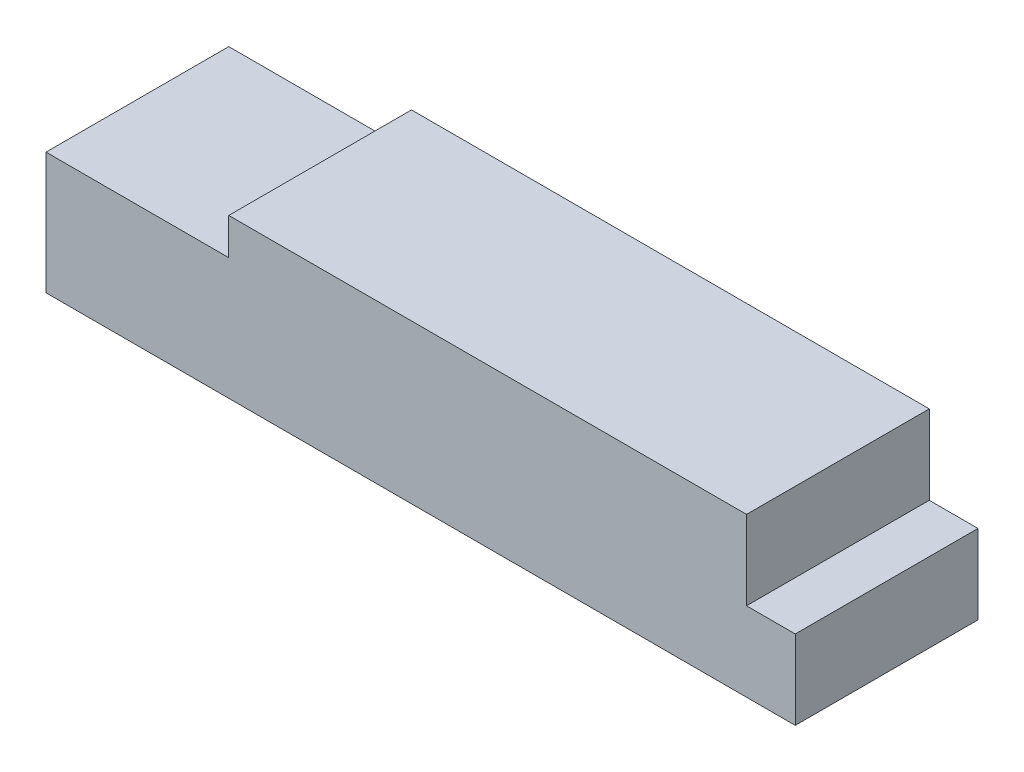
ISO-10303-21;
HEADER;
FILE_DESCRIPTION(('STEP AP214'),'2;1');
FILE_NAME('part.step','',(''),(''),'','','');
FILE_SCHEMA(('AUTOMOTIVE_DESIGN { 1 0 10303 214 1 1 1 1 }'));
ENDSEC;
DATA;
#1=APPLICATION_CONTEXT('core data for automotive mechanical design processes');
#2=APPLICATION_PROTOCOL_DEFINITION('international standard','automotive_design',2000,#1);
#3=PRODUCT_CONTEXT('',#1,'mechanical');
#4=PRODUCT('Part','Part','',(#3));
#5=PRODUCT_RELATED_PRODUCT_CATEGORY('part','',(#4));
#6=PRODUCT_DEFINITION_FORMATION('','',#4);
#7=PRODUCT_DEFINITION_CONTEXT('part definition',#1,'design');
#8=PRODUCT_DEFINITION('design','',#6,#7);
#9=PRODUCT_DEFINITION_SHAPE('','',#8);
#10=(LENGTH_UNIT() NAMED_UNIT(*) SI_UNIT(.MILLI.,.METRE.));
#11=(NAMED_UNIT(*) PLANE_ANGLE_UNIT() SI_UNIT($,.RADIAN.));
#12=(NAMED_UNIT(*) SI_UNIT($,.STERADIAN.) SOLID_ANGLE_UNIT());
#13=UNCERTAINTY_MEASURE_WITH_UNIT(LENGTH_MEASURE(1.E-05),#10,'distance_accuracy_value','');
#14=(GEOMETRIC_REPRESENTATION_CONTEXT(3) GLOBAL_UNCERTAINTY_ASSIGNED_CONTEXT((#13)) GLOBAL_UNIT_ASSIGNED_CONTEXT((#10,
#11,#12)) REPRESENTATION_CONTEXT('',''));
#15=CARTESIAN_POINT('',(0.,0.,0.));
#16=DIRECTION('',(0.,0.,1.));
#17=DIRECTION('',(1.,0.,0.));
#18=AXIS2_PLACEMENT_3D('',#15,#16,#17);
#19=CARTESIAN_POINT('',(0.,20.,15.));
#20=DIRECTION('',(1.,0.,0.));
#21=DIRECTION('',(0.,0.,-1.));
#22=AXIS2_PLACEMENT_3D('',#19,#20,#21);
#23=PLANE('',#22);
#24=DIRECTION('',(0.,-1.,0.));
#25=VECTOR('',#24,1.);
#26=CARTESIAN_POINT('',(0.,20.,-15.));
#27=LINE('',#26,#25);
#28=CARTESIAN_POINT('',(0.,20.,-15.));
#29=VERTEX_POINT('',#28);
#30=CARTESIAN_POINT('',(0.,0.,-15.));
#31=VERTEX_POINT('',#30);
#32=EDGE_CURVE('E137',#29,#31,#27,.T.);
#33=ORIENTED_EDGE('',*,*,#32,.T.);
#34=DIRECTION('',(0.,0.,-1.));
#35=VECTOR('',#34,1.);
#36=CARTESIAN_POINT('',(0.,0.,15.));
#37=LINE('',#36,#35);
#38=CARTESIAN_POINT('',(0.,0.,15.));
#39=VERTEX_POINT('',#38);
#40=EDGE_CURVE('E11',#39,#31,#37,.T.);
#41=ORIENTED_EDGE('',*,*,#40,.F.);
#42=DIRECTION('',(0.,-1.,0.));
#43=VECTOR('',#42,1.);
#44=CARTESIAN_POINT('',(0.,20.,15.));
#45=LINE('',#44,#43);
#46=CARTESIAN_POINT('',(0.,20.,15.));
#47=VERTEX_POINT('',#46);
#48=EDGE_CURVE('E151',#47,#39,#45,.T.);
#49=ORIENTED_EDGE('',*,*,#48,.F.);
#50=DIRECTION('',(0.,0.,-1.));
#51=VECTOR('',#50,1.);
#52=CARTESIAN_POINT('',(0.,20.,15.));
#53=LINE('',#52,#51);
#54=EDGE_CURVE('E133',#47,#29,#53,.T.);
#55=ORIENTED_EDGE('',*,*,#54,.T.);
#56=EDGE_LOOP('',(#33,#41,#49,#55));
#57=FACE_BOUND('',#56,.T.);
#58=ADVANCED_FACE('F41',(#57),#23,.F.);
#59=CARTESIAN_POINT('',(0.,0.,15.));
#60=DIRECTION('',(0.,1.,0.));
#61=DIRECTION('',(0.,0.,1.));
#62=AXIS2_PLACEMENT_3D('',#59,#60,#61);
#63=PLANE('',#62);
#64=DIRECTION('',(1.,0.,0.));
#65=VECTOR('',#64,1.);
#66=CARTESIAN_POINT('',(0.,0.,-15.));
#67=LINE('',#66,#65);
#68=CARTESIAN_POINT('',(123.,0.,-15.));
#69=VERTEX_POINT('',#68);
#70=EDGE_CURVE('E140',#31,#69,#67,.T.);
#71=ORIENTED_EDGE('',*,*,#70,.T.);
#72=DIRECTION('',(0.,0.,-1.));
#73=VECTOR('',#72,1.);
#74=CARTESIAN_POINT('',(123.,0.,15.));
#75=LINE('',#74,#73);
#76=CARTESIAN_POINT('',(123.,0.,15.));
#77=VERTEX_POINT('',#76);
#78=EDGE_CURVE('E49',#77,#69,#75,.T.);
#79=ORIENTED_EDGE('',*,*,#78,.F.);
#80=DIRECTION('',(1.,0.,0.));
#81=VECTOR('',#80,1.);
#82=CARTESIAN_POINT('',(0.,0.,15.));
#83=LINE('',#82,#81);
#84=EDGE_CURVE('E100',#39,#77,#83,.T.);
#85=ORIENTED_EDGE('',*,*,#84,.F.);
#86=ORIENTED_EDGE('',*,*,#40,.T.);
#87=EDGE_LOOP('',(#71,#79,#85,#86));
#88=FACE_BOUND('',#87,.T.);
#89=ADVANCED_FACE('F186',(#88),#63,.F.);
#90=CARTESIAN_POINT('',(123.,0.,15.));
#91=DIRECTION('',(-1.,0.,0.));
#92=DIRECTION('',(0.,-1.,0.));
#93=AXIS2_PLACEMENT_3D('',#90,#91,#92);
#94=PLANE('',#93);
#95=DIRECTION('',(0.,1.,0.));
#96=VECTOR('',#95,1.);
#97=CARTESIAN_POINT('',(123.,0.,-15.));
#98=LINE('',#97,#96);
#99=CARTESIAN_POINT('',(123.,13.,-15.));
#100=VERTEX_POINT('',#99);
#101=EDGE_CURVE('E142',#69,#100,#98,.T.);
#102=ORIENTED_EDGE('',*,*,#101,.T.);
#103=DIRECTION('',(0.,0.,-1.));
#104=VECTOR('',#103,1.);
#105=CARTESIAN_POINT('',(123.,13.,15.));
#106=LINE('',#105,#104);
#107=CARTESIAN_POINT('',(123.,13.,15.));
#108=VERTEX_POINT('',#107);
#109=EDGE_CURVE('E158',#108,#100,#106,.T.);
#110=ORIENTED_EDGE('',*,*,#109,.F.);
#111=DIRECTION('',(0.,1.,0.));
#112=VECTOR('',#111,1.);
#113=CARTESIAN_POINT('',(123.,0.,15.));
#114=LINE('',#113,#112);
#115=EDGE_CURVE('E166',#77,#108,#114,.T.);
#116=ORIENTED_EDGE('',*,*,#115,.F.);
#117=ORIENTED_EDGE('',*,*,#78,.T.);
#118=EDGE_LOOP('',(#102,#110,#116,#117));
#119=FACE_BOUND('',#118,.T.);
#120=ADVANCED_FACE('F164',(#119),#94,.F.);
#121=CARTESIAN_POINT('',(123.,13.,15.));
#122=DIRECTION('',(0.,-1.,0.));
#123=DIRECTION('',(1.,0.,0.));
#124=AXIS2_PLACEMENT_3D('',#121,#122,#123);
#125=PLANE('',#124);
#126=DIRECTION('',(-1.,0.,0.));
#127=VECTOR('',#126,1.);
#128=CARTESIAN_POINT('',(123.,13.,-15.));
#129=LINE('',#128,#127);
#130=CARTESIAN_POINT('',(115.,13.,-15.));
#131=VERTEX_POINT('',#130);
#132=EDGE_CURVE('E144',#100,#131,#129,.T.);
#133=ORIENTED_EDGE('',*,*,#132,.T.);
#134=DIRECTION('',(0.,0.,-1.));
#135=VECTOR('',#134,1.);
#136=CARTESIAN_POINT('',(115.,13.,15.));
#137=LINE('',#136,#135);
#138=CARTESIAN_POINT('',(115.,13.,15.));
#139=VERTEX_POINT('',#138);
#140=EDGE_CURVE('E155',#139,#131,#137,.T.);
#141=ORIENTED_EDGE('',*,*,#140,.F.);
#142=DIRECTION('',(-1.,0.,0.));
#143=VECTOR('',#142,1.);
#144=CARTESIAN_POINT('',(123.,13.,15.));
#145=LINE('',#144,#143);
#146=EDGE_CURVE('E178',#108,#139,#145,.T.);
#147=ORIENTED_EDGE('',*,*,#146,.F.);
#148=ORIENTED_EDGE('',*,*,#109,.T.);
#149=EDGE_LOOP('',(#133,#141,#147,#148));
#150=FACE_BOUND('',#149,.T.);
#151=ADVANCED_FACE('F174',(#150),#125,.F.);
#152=CARTESIAN_POINT('',(115.,13.,15.));
#153=DIRECTION('',(-1.,0.,0.));
#154=DIRECTION('',(0.,0.,1.));
#155=AXIS2_PLACEMENT_3D('',#152,#153,#154);
#156=PLANE('',#155);
#157=DIRECTION('',(0.,1.,0.));
#158=VECTOR('',#157,1.);
#159=CARTESIAN_POINT('',(115.,13.,-15.));
#160=LINE('',#159,#158);
#161=CARTESIAN_POINT('',(115.,26.,-15.));
#162=VERTEX_POINT('',#161);
#163=EDGE_CURVE('E146',#131,#162,#160,.T.);
#164=ORIENTED_EDGE('',*,*,#163,.T.);
#165=DIRECTION('',(0.,0.,-1.));
#166=VECTOR('',#165,1.);
#167=CARTESIAN_POINT('',(115.,26.,15.));
#168=LINE('',#167,#166);
#169=CARTESIAN_POINT('',(115.,26.,15.));
#170=VERTEX_POINT('',#169);
#171=EDGE_CURVE('E128',#170,#162,#168,.T.);
#172=ORIENTED_EDGE('',*,*,#171,.F.);
#173=DIRECTION('',(0.,1.,0.));
#174=VECTOR('',#173,1.);
#175=CARTESIAN_POINT('',(115.,13.,15.));
#176=LINE('',#175,#174);
#177=EDGE_CURVE('E119',#139,#170,#176,.T.);
#178=ORIENTED_EDGE('',*,*,#177,.F.);
#179=ORIENTED_EDGE('',*,*,#140,.T.);
#180=EDGE_LOOP('',(#164,#172,#178,#179));
#181=FACE_BOUND('',#180,.T.);
#182=ADVANCED_FACE('F177',(#181),#156,.F.);
#183=CARTESIAN_POINT('',(115.,26.,15.));
#184=DIRECTION('',(0.,-1.,0.));
#185=DIRECTION('',(1.,0.,0.));
#186=AXIS2_PLACEMENT_3D('',#183,#184,#185);
#187=PLANE('',#186);
#188=DIRECTION('',(-1.,0.,0.));
#189=VECTOR('',#188,1.);
#190=CARTESIAN_POINT('',(115.,26.,-15.));
#191=LINE('',#190,#189);
#192=CARTESIAN_POINT('',(30.,26.,-15.));
#193=VERTEX_POINT('',#192);
#194=EDGE_CURVE('E127',#162,#193,#191,.T.);
#195=ORIENTED_EDGE('',*,*,#194,.T.);
#196=DIRECTION('',(0.,0.,-1.));
#197=VECTOR('',#196,1.);
#198=CARTESIAN_POINT('',(30.,26.,15.));
#199=LINE('',#198,#197);
#200=CARTESIAN_POINT('',(30.,26.,15.));
#201=VERTEX_POINT('',#200);
#202=EDGE_CURVE('E124',#201,#193,#199,.T.);
#203=ORIENTED_EDGE('',*,*,#202,.F.);
#204=DIRECTION('',(-1.,0.,0.));
#205=VECTOR('',#204,1.);
#206=CARTESIAN_POINT('',(115.,26.,15.));
#207=LINE('',#206,#205);
#208=EDGE_CURVE('E113',#170,#201,#207,.T.);
#209=ORIENTED_EDGE('',*,*,#208,.F.);
#210=ORIENTED_EDGE('',*,*,#171,.T.);
#211=EDGE_LOOP('',(#195,#203,#209,#210));
#212=FACE_BOUND('',#211,.T.);
#213=ADVANCED_FACE('F125',(#212),#187,.F.);
#214=CARTESIAN_POINT('',(30.,26.,15.));
#215=DIRECTION('',(1.,0.,0.));
#216=DIRECTION('',(0.,0.,-1.));
#217=AXIS2_PLACEMENT_3D('',#214,#215,#216);
#218=PLANE('',#217);
#219=DIRECTION('',(0.,-1.,0.));
#220=VECTOR('',#219,1.);
#221=CARTESIAN_POINT('',(30.,26.,-15.));
#222=LINE('',#221,#220);
#223=CARTESIAN_POINT('',(30.,20.,-15.));
#224=VERTEX_POINT('',#223);
#225=EDGE_CURVE('E86',#193,#224,#222,.T.);
#226=ORIENTED_EDGE('',*,*,#225,.T.);
#227=DIRECTION('',(0.,0.,-1.));
#228=VECTOR('',#227,1.);
#229=CARTESIAN_POINT('',(30.,20.,15.));
#230=LINE('',#229,#228);
#231=CARTESIAN_POINT('',(30.,20.,15.));
#232=VERTEX_POINT('',#231);
#233=EDGE_CURVE('E129',#232,#224,#230,.T.);
#234=ORIENTED_EDGE('',*,*,#233,.F.);
#235=DIRECTION('',(0.,-1.,0.));
#236=VECTOR('',#235,1.);
#237=CARTESIAN_POINT('',(30.,26.,15.));
#238=LINE('',#237,#236);
#239=EDGE_CURVE('E117',#201,#232,#238,.T.);
#240=ORIENTED_EDGE('',*,*,#239,.F.);
#241=ORIENTED_EDGE('',*,*,#202,.T.);
#242=EDGE_LOOP('',(#226,#234,#240,#241));
#243=FACE_BOUND('',#242,.T.);
#244=ADVANCED_FACE('F131',(#243),#218,.F.);
#245=CARTESIAN_POINT('',(30.,20.,15.));
#246=DIRECTION('',(0.,-1.,0.));
#247=DIRECTION('',(1.,0.,0.));
#248=AXIS2_PLACEMENT_3D('',#245,#246,#247);
#249=PLANE('',#248);
#250=DIRECTION('',(-1.,0.,0.));
#251=VECTOR('',#250,1.);
#252=CARTESIAN_POINT('',(30.,20.,-15.));
#253=LINE('',#252,#251);
#254=EDGE_CURVE('E92',#224,#29,#253,.T.);
#255=ORIENTED_EDGE('',*,*,#254,.T.);
#256=ORIENTED_EDGE('',*,*,#54,.F.);
#257=DIRECTION('',(-1.,0.,0.));
#258=VECTOR('',#257,1.);
#259=CARTESIAN_POINT('',(30.,20.,15.));
#260=LINE('',#259,#258);
#261=EDGE_CURVE('E57',#232,#47,#260,.T.);
#262=ORIENTED_EDGE('',*,*,#261,.F.);
#263=ORIENTED_EDGE('',*,*,#233,.T.);
#264=EDGE_LOOP('',(#255,#256,#262,#263));
#265=FACE_BOUND('',#264,.T.);
#266=ADVANCED_FACE('F202',(#265),#249,.F.);
#267=CARTESIAN_POINT('',(0.,0.,15.));
#268=DIRECTION('',(0.,0.,1.));
#269=DIRECTION('',(1.,0.,0.));
#270=AXIS2_PLACEMENT_3D('',#267,#268,#269);
#271=PLANE('',#270);
#272=ORIENTED_EDGE('',*,*,#48,.T.);
#273=ORIENTED_EDGE('',*,*,#84,.T.);
#274=ORIENTED_EDGE('',*,*,#115,.T.);
#275=ORIENTED_EDGE('',*,*,#146,.T.);
#276=ORIENTED_EDGE('',*,*,#177,.T.);
#277=ORIENTED_EDGE('',*,*,#208,.T.);
#278=ORIENTED_EDGE('',*,*,#239,.T.);
#279=ORIENTED_EDGE('',*,*,#261,.T.);
#280=EDGE_LOOP('',(#272,#273,#274,#275,#276,#277,#278,#279));
#281=FACE_BOUND('',#280,.T.);
#282=ADVANCED_FACE('F115',(#281),#271,.T.);
#283=CARTESIAN_POINT('',(0.,0.,-15.));
#284=DIRECTION('',(0.,0.,1.));
#285=DIRECTION('',(1.,0.,0.));
#286=AXIS2_PLACEMENT_3D('',#283,#284,#285);
#287=PLANE('',#286);
#288=ORIENTED_EDGE('',*,*,#32,.F.);
#289=ORIENTED_EDGE('',*,*,#254,.F.);
#290=ORIENTED_EDGE('',*,*,#225,.F.);
#291=ORIENTED_EDGE('',*,*,#194,.F.);
#292=ORIENTED_EDGE('',*,*,#163,.F.);
#293=ORIENTED_EDGE('',*,*,#132,.F.);
#294=ORIENTED_EDGE('',*,*,#101,.F.);
#295=ORIENTED_EDGE('',*,*,#70,.F.);
#296=EDGE_LOOP('',(#288,#289,#290,#291,#292,#293,#294,#295));
#297=FACE_BOUND('',#296,.T.);
#298=ADVANCED_FACE('F170',(#297),#287,.F.);
#299=CLOSED_SHELL('',(#58,#89,#120,#151,#182,#213,#244,#266,#282,#298));
#300=MANIFOLD_SOLID_BREP('B2',#299);
#301=ADVANCED_BREP_SHAPE_REPRESENTATION('',(#18,#300),#14);
#302=SHAPE_DEFINITION_REPRESENTATION(#9,#301);
ENDSEC;
END-ISO-10303-21;
